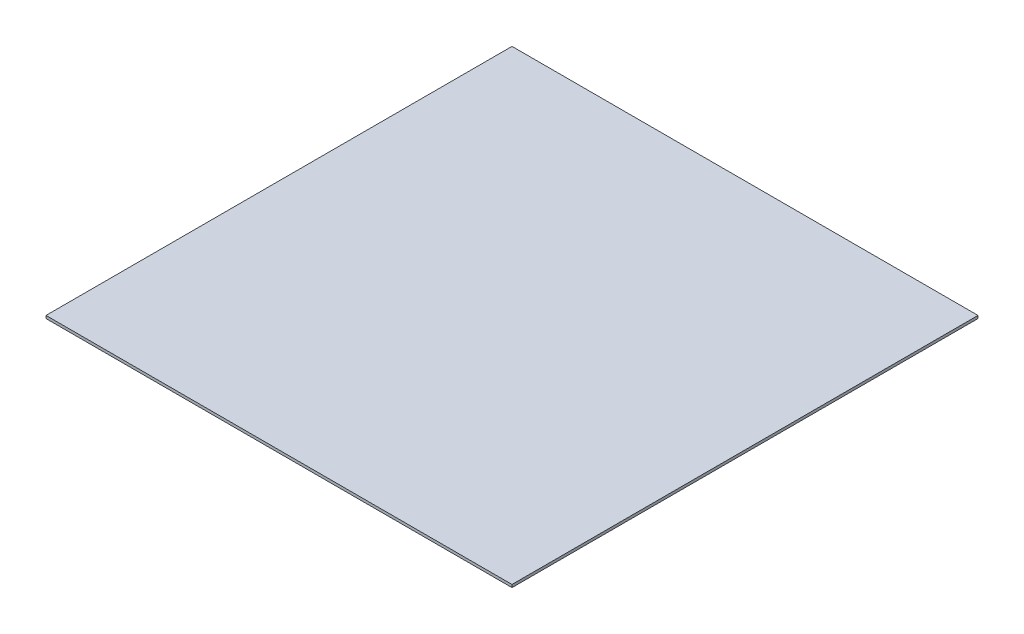
ISO-10303-21;
HEADER;
FILE_DESCRIPTION(('STEP AP214'),'2;1');
FILE_NAME('part.step','',(''),(''),'','','');
FILE_SCHEMA(('AUTOMOTIVE_DESIGN { 1 0 10303 214 1 1 1 1 }'));
ENDSEC;
DATA;
#1=APPLICATION_CONTEXT('core data for automotive mechanical design processes');
#2=APPLICATION_PROTOCOL_DEFINITION('international standard','automotive_design',2000,#1);
#3=PRODUCT_CONTEXT('',#1,'mechanical');
#4=PRODUCT('Part','Part','',(#3));
#5=PRODUCT_RELATED_PRODUCT_CATEGORY('part','',(#4));
#6=PRODUCT_DEFINITION_FORMATION('','',#4);
#7=PRODUCT_DEFINITION_CONTEXT('part definition',#1,'design');
#8=PRODUCT_DEFINITION('design','',#6,#7);
#9=PRODUCT_DEFINITION_SHAPE('','',#8);
#10=(LENGTH_UNIT() NAMED_UNIT(*) SI_UNIT(.MILLI.,.METRE.));
#11=(NAMED_UNIT(*) PLANE_ANGLE_UNIT() SI_UNIT($,.RADIAN.));
#12=(NAMED_UNIT(*) SI_UNIT($,.STERADIAN.) SOLID_ANGLE_UNIT());
#13=UNCERTAINTY_MEASURE_WITH_UNIT(LENGTH_MEASURE(1.E-05),#10,'distance_accuracy_value','');
#14=(GEOMETRIC_REPRESENTATION_CONTEXT(3) GLOBAL_UNCERTAINTY_ASSIGNED_CONTEXT((#13)) GLOBAL_UNIT_ASSIGNED_CONTEXT((#10,
#11,#12)) REPRESENTATION_CONTEXT('',''));
#15=CARTESIAN_POINT('',(0.,0.,0.));
#16=DIRECTION('',(0.,0.,1.));
#17=DIRECTION('',(1.,0.,0.));
#18=AXIS2_PLACEMENT_3D('',#15,#16,#17);
#19=CARTESIAN_POINT('',(-254.,3.,254.));
#20=DIRECTION('',(1.,0.,0.));
#21=DIRECTION('',(0.,0.,-1.));
#22=AXIS2_PLACEMENT_3D('',#19,#20,#21);
#23=PLANE('',#22);
#24=DIRECTION('',(0.,0.,1.));
#25=VECTOR('',#24,1.);
#26=CARTESIAN_POINT('',(-254.,0.,254.));
#27=LINE('',#26,#25);
#28=CARTESIAN_POINT('',(-254.,0.,-254.));
#29=VERTEX_POINT('',#28);
#30=CARTESIAN_POINT('',(-254.,0.,254.));
#31=VERTEX_POINT('',#30);
#32=EDGE_CURVE('E107',#29,#31,#27,.T.);
#33=ORIENTED_EDGE('',*,*,#32,.T.);
#34=DIRECTION('',(0.,-1.,0.));
#35=VECTOR('',#34,1.);
#36=CARTESIAN_POINT('',(-254.,3.,254.));
#37=LINE('',#36,#35);
#38=CARTESIAN_POINT('',(-254.,3.,254.));
#39=VERTEX_POINT('',#38);
#40=EDGE_CURVE('E11',#39,#31,#37,.T.);
#41=ORIENTED_EDGE('',*,*,#40,.F.);
#42=DIRECTION('',(0.,0.,1.));
#43=VECTOR('',#42,1.);
#44=CARTESIAN_POINT('',(-254.,3.,254.));
#45=LINE('',#44,#43);
#46=CARTESIAN_POINT('',(-254.,3.,-254.));
#47=VERTEX_POINT('',#46);
#48=EDGE_CURVE('E91',#47,#39,#45,.T.);
#49=ORIENTED_EDGE('',*,*,#48,.F.);
#50=DIRECTION('',(0.,-1.,0.));
#51=VECTOR('',#50,1.);
#52=CARTESIAN_POINT('',(-254.,3.,-254.));
#53=LINE('',#52,#51);
#54=EDGE_CURVE('E103',#47,#29,#53,.T.);
#55=ORIENTED_EDGE('',*,*,#54,.T.);
#56=EDGE_LOOP('',(#33,#41,#49,#55));
#57=FACE_BOUND('',#56,.T.);
#58=ADVANCED_FACE('F39',(#57),#23,.F.);
#59=CARTESIAN_POINT('',(254.,3.,254.));
#60=DIRECTION('',(0.,0.,-1.));
#61=DIRECTION('',(-1.,0.,0.));
#62=AXIS2_PLACEMENT_3D('',#59,#60,#61);
#63=PLANE('',#62);
#64=DIRECTION('',(1.,0.,0.));
#65=VECTOR('',#64,1.);
#66=CARTESIAN_POINT('',(254.,0.,254.));
#67=LINE('',#66,#65);
#68=CARTESIAN_POINT('',(254.,0.,254.));
#69=VERTEX_POINT('',#68);
#70=EDGE_CURVE('E96',#31,#69,#67,.T.);
#71=ORIENTED_EDGE('',*,*,#70,.T.);
#72=DIRECTION('',(0.,-1.,0.));
#73=VECTOR('',#72,1.);
#74=CARTESIAN_POINT('',(254.,3.,254.));
#75=LINE('',#74,#73);
#76=CARTESIAN_POINT('',(254.,3.,254.));
#77=VERTEX_POINT('',#76);
#78=EDGE_CURVE('E48',#77,#69,#75,.T.);
#79=ORIENTED_EDGE('',*,*,#78,.F.);
#80=DIRECTION('',(1.,0.,0.));
#81=VECTOR('',#80,1.);
#82=CARTESIAN_POINT('',(254.,3.,254.));
#83=LINE('',#82,#81);
#84=EDGE_CURVE('E86',#39,#77,#83,.T.);
#85=ORIENTED_EDGE('',*,*,#84,.F.);
#86=ORIENTED_EDGE('',*,*,#40,.T.);
#87=EDGE_LOOP('',(#71,#79,#85,#86));
#88=FACE_BOUND('',#87,.T.);
#89=ADVANCED_FACE('F95',(#88),#63,.F.);
#90=CARTESIAN_POINT('',(254.,3.,254.));
#91=DIRECTION('',(-1.,0.,0.));
#92=DIRECTION('',(0.,0.,1.));
#93=AXIS2_PLACEMENT_3D('',#90,#91,#92);
#94=PLANE('',#93);
#95=DIRECTION('',(0.,0.,-1.));
#96=VECTOR('',#95,1.);
#97=CARTESIAN_POINT('',(254.,0.,254.));
#98=LINE('',#97,#96);
#99=CARTESIAN_POINT('',(254.,0.,-254.));
#100=VERTEX_POINT('',#99);
#101=EDGE_CURVE('E73',#69,#100,#98,.T.);
#102=ORIENTED_EDGE('',*,*,#101,.T.);
#103=DIRECTION('',(0.,-1.,0.));
#104=VECTOR('',#103,1.);
#105=CARTESIAN_POINT('',(254.,3.,-254.));
#106=LINE('',#105,#104);
#107=CARTESIAN_POINT('',(254.,3.,-254.));
#108=VERTEX_POINT('',#107);
#109=EDGE_CURVE('E98',#108,#100,#106,.T.);
#110=ORIENTED_EDGE('',*,*,#109,.F.);
#111=DIRECTION('',(0.,0.,-1.));
#112=VECTOR('',#111,1.);
#113=CARTESIAN_POINT('',(254.,3.,254.));
#114=LINE('',#113,#112);
#115=EDGE_CURVE('E89',#77,#108,#114,.T.);
#116=ORIENTED_EDGE('',*,*,#115,.F.);
#117=ORIENTED_EDGE('',*,*,#78,.T.);
#118=EDGE_LOOP('',(#102,#110,#116,#117));
#119=FACE_BOUND('',#118,.T.);
#120=ADVANCED_FACE('F99',(#119),#94,.F.);
#121=CARTESIAN_POINT('',(254.,3.,-254.));
#122=DIRECTION('',(0.,0.,1.));
#123=DIRECTION('',(1.,0.,0.));
#124=AXIS2_PLACEMENT_3D('',#121,#122,#123);
#125=PLANE('',#124);
#126=DIRECTION('',(-1.,0.,0.));
#127=VECTOR('',#126,1.);
#128=CARTESIAN_POINT('',(254.,0.,-254.));
#129=LINE('',#128,#127);
#130=EDGE_CURVE('E79',#100,#29,#129,.T.);
#131=ORIENTED_EDGE('',*,*,#130,.T.);
#132=ORIENTED_EDGE('',*,*,#54,.F.);
#133=DIRECTION('',(-1.,0.,0.));
#134=VECTOR('',#133,1.);
#135=CARTESIAN_POINT('',(254.,3.,-254.));
#136=LINE('',#135,#134);
#137=EDGE_CURVE('E56',#108,#47,#136,.T.);
#138=ORIENTED_EDGE('',*,*,#137,.F.);
#139=ORIENTED_EDGE('',*,*,#109,.T.);
#140=EDGE_LOOP('',(#131,#132,#138,#139));
#141=FACE_BOUND('',#140,.T.);
#142=ADVANCED_FACE('F120',(#141),#125,.F.);
#143=CARTESIAN_POINT('',(0.,3.,0.));
#144=DIRECTION('',(0.,1.,0.));
#145=DIRECTION('',(0.,0.,1.));
#146=AXIS2_PLACEMENT_3D('',#143,#144,#145);
#147=PLANE('',#146);
#148=ORIENTED_EDGE('',*,*,#48,.T.);
#149=ORIENTED_EDGE('',*,*,#84,.T.);
#150=ORIENTED_EDGE('',*,*,#115,.T.);
#151=ORIENTED_EDGE('',*,*,#137,.T.);
#152=EDGE_LOOP('',(#148,#149,#150,#151));
#153=FACE_BOUND('',#152,.T.);
#154=ADVANCED_FACE('F87',(#153),#147,.T.);
#155=CARTESIAN_POINT('',(0.,0.,0.));
#156=DIRECTION('',(0.,1.,0.));
#157=DIRECTION('',(0.,0.,1.));
#158=AXIS2_PLACEMENT_3D('',#155,#156,#157);
#159=PLANE('',#158);
#160=ORIENTED_EDGE('',*,*,#32,.F.);
#161=ORIENTED_EDGE('',*,*,#130,.F.);
#162=ORIENTED_EDGE('',*,*,#101,.F.);
#163=ORIENTED_EDGE('',*,*,#70,.F.);
#164=EDGE_LOOP('',(#160,#161,#162,#163));
#165=FACE_BOUND('',#164,.T.);
#166=ADVANCED_FACE('F123',(#165),#159,.F.);
#167=CLOSED_SHELL('',(#58,#89,#120,#142,#154,#166));
#168=MANIFOLD_SOLID_BREP('B2',#167);
#169=ADVANCED_BREP_SHAPE_REPRESENTATION('',(#18,#168),#14);
#170=SHAPE_DEFINITION_REPRESENTATION(#9,#169);
ENDSEC;
END-ISO-10303-21;
